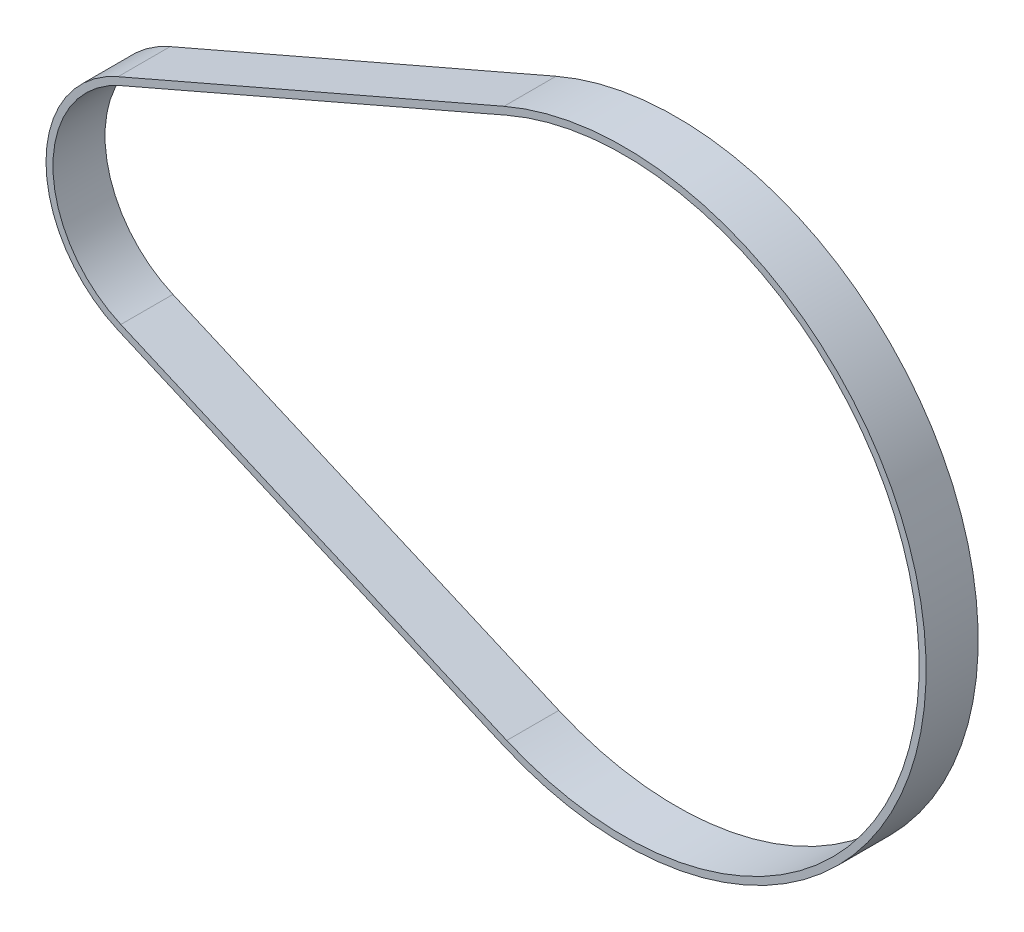
ISO-10303-21;
HEADER;
FILE_DESCRIPTION(('STEP AP214'),'2;1');
FILE_NAME('part.step','',(''),(''),'','','');
FILE_SCHEMA(('AUTOMOTIVE_DESIGN { 1 0 10303 214 1 1 1 1 }'));
ENDSEC;
DATA;
#1=APPLICATION_CONTEXT('core data for automotive mechanical design processes');
#2=APPLICATION_PROTOCOL_DEFINITION('international standard','automotive_design',2000,#1);
#3=PRODUCT_CONTEXT('',#1,'mechanical');
#4=PRODUCT('Part','Part','',(#3));
#5=PRODUCT_RELATED_PRODUCT_CATEGORY('part','',(#4));
#6=PRODUCT_DEFINITION_FORMATION('','',#4);
#7=PRODUCT_DEFINITION_CONTEXT('part definition',#1,'design');
#8=PRODUCT_DEFINITION('design','',#6,#7);
#9=PRODUCT_DEFINITION_SHAPE('','',#8);
#10=(LENGTH_UNIT() NAMED_UNIT(*) SI_UNIT(.MILLI.,.METRE.));
#11=(NAMED_UNIT(*) PLANE_ANGLE_UNIT() SI_UNIT($,.RADIAN.));
#12=(NAMED_UNIT(*) SI_UNIT($,.STERADIAN.) SOLID_ANGLE_UNIT());
#13=UNCERTAINTY_MEASURE_WITH_UNIT(LENGTH_MEASURE(1.E-05),#10,'distance_accuracy_value','');
#14=(GEOMETRIC_REPRESENTATION_CONTEXT(3) GLOBAL_UNCERTAINTY_ASSIGNED_CONTEXT((#13)) GLOBAL_UNIT_ASSIGNED_CONTEXT((#10,
#11,#12)) REPRESENTATION_CONTEXT('',''));
#15=CARTESIAN_POINT('',(0.,0.,0.));
#16=DIRECTION('',(0.,0.,1.));
#17=DIRECTION('',(1.,0.,0.));
#18=AXIS2_PLACEMENT_3D('',#15,#16,#17);
#19=CARTESIAN_POINT('',(5.16947595841089E-13,0.,3.));
#20=DIRECTION('',(0.,0.,1.));
#21=DIRECTION('',(1.,0.,0.));
#22=AXIS2_PLACEMENT_3D('',#19,#20,#21);
#23=PLANE('',#22);
#24=CARTESIAN_POINT('',(5.16947595841089E-13,0.,3.));
#25=DIRECTION('',(0.,0.,1.));
#26=DIRECTION('',(1.,0.,0.));
#27=AXIS2_PLACEMENT_3D('',#24,#25,#26);
#28=CIRCLE('',#27,13.7880150000005);
#29=CARTESIAN_POINT('',(-5.4839995872167,12.650498257683,3.));
#30=VERTEX_POINT('',#29);
#31=CARTESIAN_POINT('',(-5.4839995872167,-12.650498257683,3.));
#32=VERTEX_POINT('',#31);
#33=EDGE_CURVE('E112',#30,#32,#28,.T.);
#34=ORIENTED_EDGE('',*,*,#33,.T.);
#35=DIRECTION('',(0.917499600753454,-0.397736700113596,0.));
#36=VECTOR('',#35,1.);
#37=CARTESIAN_POINT('',(-5.4839995872167,-12.650498257683,3.));
#38=LINE('',#37,#36);
#39=CARTESIAN_POINT('',(38.98016784094,-31.925745038881,3.));
#40=VERTEX_POINT('',#39);
#41=EDGE_CURVE('E155',#32,#40,#38,.T.);
#42=ORIENTED_EDGE('',*,*,#41,.T.);
#43=CARTESIAN_POINT('',(52.8199999999997,0.,3.));
#44=DIRECTION('',(0.,0.,1.));
#45=DIRECTION('',(1.,0.,0.));
#46=AXIS2_PLACEMENT_3D('',#43,#44,#45);
#47=CIRCLE('',#46,34.7964675000003);
#48=CARTESIAN_POINT('',(38.98016784094,31.925745038881,3.));
#49=VERTEX_POINT('',#48);
#50=EDGE_CURVE('E157',#40,#49,#47,.T.);
#51=ORIENTED_EDGE('',*,*,#50,.T.);
#52=DIRECTION('',(-0.917499600753454,-0.397736700113596,0.));
#53=VECTOR('',#52,1.);
#54=CARTESIAN_POINT('',(38.98016784094,31.925745038881,3.));
#55=LINE('',#54,#53);
#56=EDGE_CURVE('E59',#49,#30,#55,.T.);
#57=ORIENTED_EDGE('',*,*,#56,.T.);
#58=EDGE_LOOP('',(#34,#42,#51,#57));
#59=FACE_BOUND('',#58,.T.);
#60=DIRECTION('',(0.917499600753455,-0.397736700113594,0.));
#61=VECTOR('',#60,1.);
#62=CARTESIAN_POINT('',(-5.1658102271259,-11.91649857708,3.));
#63=LINE('',#62,#61);
#64=CARTESIAN_POINT('',(-5.1658102271259,-11.91649857708,3.));
#65=VERTEX_POINT('',#64);
#66=CARTESIAN_POINT('',(39.298357201031,-31.191745358278,3.));
#67=VERTEX_POINT('',#66);
#68=EDGE_CURVE('E144',#65,#67,#63,.T.);
#69=ORIENTED_EDGE('',*,*,#68,.F.);
#70=CARTESIAN_POINT('',(5.16947595841089E-13,0.,3.));
#71=DIRECTION('',(0.,0.,1.));
#72=DIRECTION('',(1.,0.,0.));
#73=AXIS2_PLACEMENT_3D('',#70,#71,#72);
#74=CIRCLE('',#73,12.9880150000003);
#75=CARTESIAN_POINT('',(-5.1658102271259,11.91649857708,3.));
#76=VERTEX_POINT('',#75);
#77=EDGE_CURVE('E109',#76,#65,#74,.T.);
#78=ORIENTED_EDGE('',*,*,#77,.F.);
#79=DIRECTION('',(-0.917499600753455,-0.397736700113594,0.));
#80=VECTOR('',#79,1.);
#81=CARTESIAN_POINT('',(39.298357201031,31.191745358278,3.));
#82=LINE('',#81,#80);
#83=CARTESIAN_POINT('',(39.298357201031,31.191745358278,3.));
#84=VERTEX_POINT('',#83);
#85=EDGE_CURVE('E148',#84,#76,#82,.T.);
#86=ORIENTED_EDGE('',*,*,#85,.F.);
#87=CARTESIAN_POINT('',(52.8199999999997,0.,3.));
#88=DIRECTION('',(0.,0.,1.));
#89=DIRECTION('',(1.,0.,0.));
#90=AXIS2_PLACEMENT_3D('',#87,#88,#89);
#91=CIRCLE('',#90,33.9964675);
#92=EDGE_CURVE('E146',#67,#84,#91,.T.);
#93=ORIENTED_EDGE('',*,*,#92,.F.);
#94=EDGE_LOOP('',(#69,#78,#86,#93));
#95=FACE_BOUND('',#94,.T.);
#96=ADVANCED_FACE('F36',(#59,#95),#23,.T.);
#97=CARTESIAN_POINT('',(5.16947595841089E-13,0.,3.));
#98=DIRECTION('',(0.,0.,-1.));
#99=DIRECTION('',(-1.,0.,0.));
#100=AXIS2_PLACEMENT_3D('',#97,#98,#99);
#101=CYLINDRICAL_SURFACE('',#100,13.7880150000005);
#102=DIRECTION('',(0.,0.,-1.));
#103=VECTOR('',#102,1.);
#104=CARTESIAN_POINT('',(-5.4839995872167,12.650498257683,3.));
#105=LINE('',#104,#103);
#106=CARTESIAN_POINT('',(-5.4839995872167,12.650498257683,-3.));
#107=VERTEX_POINT('',#106);
#108=EDGE_CURVE('E160',#30,#107,#105,.T.);
#109=ORIENTED_EDGE('',*,*,#108,.T.);
#110=CARTESIAN_POINT('',(5.16947595841089E-13,0.,-3.));
#111=DIRECTION('',(0.,0.,1.));
#112=DIRECTION('',(1.,0.,0.));
#113=AXIS2_PLACEMENT_3D('',#110,#111,#112);
#114=CIRCLE('',#113,13.7880150000005);
#115=CARTESIAN_POINT('',(-5.4839995872167,-12.650498257683,-3.));
#116=VERTEX_POINT('',#115);
#117=EDGE_CURVE('E131',#107,#116,#114,.T.);
#118=ORIENTED_EDGE('',*,*,#117,.T.);
#119=DIRECTION('',(0.,0.,-1.));
#120=VECTOR('',#119,1.);
#121=CARTESIAN_POINT('',(-5.4839995872167,-12.650498257683,3.));
#122=LINE('',#121,#120);
#123=EDGE_CURVE('E11',#32,#116,#122,.T.);
#124=ORIENTED_EDGE('',*,*,#123,.F.);
#125=ORIENTED_EDGE('',*,*,#33,.F.);
#126=EDGE_LOOP('',(#109,#118,#124,#125));
#127=FACE_BOUND('',#126,.T.);
#128=ADVANCED_FACE('F38',(#127),#101,.T.);
#129=CARTESIAN_POINT('',(-5.4839995872167,-12.650498257683,3.));
#130=DIRECTION('',(0.397736700113596,0.917499600753454,0.));
#131=DIRECTION('',(-0.917499600753454,0.397736700113596,0.));
#132=AXIS2_PLACEMENT_3D('',#129,#130,#131);
#133=PLANE('',#132);
#134=ORIENTED_EDGE('',*,*,#123,.T.);
#135=DIRECTION('',(0.917499600753454,-0.397736700113596,0.));
#136=VECTOR('',#135,1.);
#137=CARTESIAN_POINT('',(-5.4839995872167,-12.650498257683,-3.));
#138=LINE('',#137,#136);
#139=CARTESIAN_POINT('',(38.98016784094,-31.925745038881,-3.));
#140=VERTEX_POINT('',#139);
#141=EDGE_CURVE('E134',#116,#140,#138,.T.);
#142=ORIENTED_EDGE('',*,*,#141,.T.);
#143=DIRECTION('',(0.,0.,-1.));
#144=VECTOR('',#143,1.);
#145=CARTESIAN_POINT('',(38.98016784094,-31.925745038881,3.));
#146=LINE('',#145,#144);
#147=EDGE_CURVE('E44',#40,#140,#146,.T.);
#148=ORIENTED_EDGE('',*,*,#147,.F.);
#149=ORIENTED_EDGE('',*,*,#41,.F.);
#150=EDGE_LOOP('',(#134,#142,#148,#149));
#151=FACE_BOUND('',#150,.T.);
#152=ADVANCED_FACE('F173',(#151),#133,.F.);
#153=CARTESIAN_POINT('',(52.8199999999997,0.,3.));
#154=DIRECTION('',(0.,0.,-1.));
#155=DIRECTION('',(-1.,0.,0.));
#156=AXIS2_PLACEMENT_3D('',#153,#154,#155);
#157=CYLINDRICAL_SURFACE('',#156,34.7964675000003);
#158=ORIENTED_EDGE('',*,*,#147,.T.);
#159=CARTESIAN_POINT('',(52.8199999999997,0.,-3.));
#160=DIRECTION('',(0.,0.,1.));
#161=DIRECTION('',(1.,0.,0.));
#162=AXIS2_PLACEMENT_3D('',#159,#160,#161);
#163=CIRCLE('',#162,34.7964675000003);
#164=CARTESIAN_POINT('',(38.98016784094,31.925745038881,-3.));
#165=VERTEX_POINT('',#164);
#166=EDGE_CURVE('E137',#140,#165,#163,.T.);
#167=ORIENTED_EDGE('',*,*,#166,.T.);
#168=DIRECTION('',(0.,0.,-1.));
#169=VECTOR('',#168,1.);
#170=CARTESIAN_POINT('',(38.98016784094,31.925745038881,3.));
#171=LINE('',#170,#169);
#172=EDGE_CURVE('E162',#49,#165,#171,.T.);
#173=ORIENTED_EDGE('',*,*,#172,.F.);
#174=ORIENTED_EDGE('',*,*,#50,.F.);
#175=EDGE_LOOP('',(#158,#167,#173,#174));
#176=FACE_BOUND('',#175,.T.);
#177=ADVANCED_FACE('F167',(#176),#157,.T.);
#178=CARTESIAN_POINT('',(38.98016784094,31.925745038881,3.));
#179=DIRECTION('',(0.397736700113596,-0.917499600753454,0.));
#180=DIRECTION('',(0.917499600753454,0.397736700113596,0.));
#181=AXIS2_PLACEMENT_3D('',#178,#179,#180);
#182=PLANE('',#181);
#183=ORIENTED_EDGE('',*,*,#172,.T.);
#184=DIRECTION('',(-0.917499600753454,-0.397736700113596,0.));
#185=VECTOR('',#184,1.);
#186=CARTESIAN_POINT('',(38.98016784094,31.925745038881,-3.));
#187=LINE('',#186,#185);
#188=EDGE_CURVE('E140',#165,#107,#187,.T.);
#189=ORIENTED_EDGE('',*,*,#188,.T.);
#190=ORIENTED_EDGE('',*,*,#108,.F.);
#191=ORIENTED_EDGE('',*,*,#56,.F.);
#192=EDGE_LOOP('',(#183,#189,#190,#191));
#193=FACE_BOUND('',#192,.T.);
#194=ADVANCED_FACE('F178',(#193),#182,.F.);
#195=CARTESIAN_POINT('',(5.16947595841089E-13,0.,3.));
#196=DIRECTION('',(0.,0.,-1.));
#197=DIRECTION('',(-1.,0.,0.));
#198=AXIS2_PLACEMENT_3D('',#195,#196,#197);
#199=CYLINDRICAL_SURFACE('',#198,12.9880150000003);
#200=DIRECTION('',(0.,0.,-1.));
#201=VECTOR('',#200,1.);
#202=CARTESIAN_POINT('',(-5.1658102271259,-11.91649857708,3.));
#203=LINE('',#202,#201);
#204=CARTESIAN_POINT('',(-5.1658102271259,-11.91649857708,-3.));
#205=VERTEX_POINT('',#204);
#206=EDGE_CURVE('E101',#65,#205,#203,.T.);
#207=ORIENTED_EDGE('',*,*,#206,.T.);
#208=CARTESIAN_POINT('',(5.16947595841089E-13,0.,-3.));
#209=DIRECTION('',(0.,0.,1.));
#210=DIRECTION('',(1.,0.,0.));
#211=AXIS2_PLACEMENT_3D('',#208,#209,#210);
#212=CIRCLE('',#211,12.9880150000003);
#213=CARTESIAN_POINT('',(-5.1658102271259,11.91649857708,-3.));
#214=VERTEX_POINT('',#213);
#215=EDGE_CURVE('E106',#214,#205,#212,.T.);
#216=ORIENTED_EDGE('',*,*,#215,.F.);
#217=DIRECTION('',(0.,0.,-1.));
#218=VECTOR('',#217,1.);
#219=CARTESIAN_POINT('',(-5.1658102271259,11.91649857708,3.));
#220=LINE('',#219,#218);
#221=EDGE_CURVE('E150',#76,#214,#220,.T.);
#222=ORIENTED_EDGE('',*,*,#221,.F.);
#223=ORIENTED_EDGE('',*,*,#77,.T.);
#224=EDGE_LOOP('',(#207,#216,#222,#223));
#225=FACE_BOUND('',#224,.T.);
#226=ADVANCED_FACE('F103',(#225),#199,.F.);
#227=CARTESIAN_POINT('',(-5.1658102271259,-11.91649857708,3.));
#228=DIRECTION('',(0.397736700113594,0.917499600753455,0.));
#229=DIRECTION('',(-0.917499600753455,0.397736700113594,0.));
#230=AXIS2_PLACEMENT_3D('',#227,#228,#229);
#231=PLANE('',#230);
#232=DIRECTION('',(0.,0.,-1.));
#233=VECTOR('',#232,1.);
#234=CARTESIAN_POINT('',(39.298357201031,-31.191745358278,3.));
#235=LINE('',#234,#233);
#236=CARTESIAN_POINT('',(39.298357201031,-31.191745358278,-3.));
#237=VERTEX_POINT('',#236);
#238=EDGE_CURVE('E113',#67,#237,#235,.T.);
#239=ORIENTED_EDGE('',*,*,#238,.T.);
#240=DIRECTION('',(0.917499600753455,-0.397736700113594,0.));
#241=VECTOR('',#240,1.);
#242=CARTESIAN_POINT('',(-5.1658102271259,-11.91649857708,-3.));
#243=LINE('',#242,#241);
#244=EDGE_CURVE('E116',#205,#237,#243,.T.);
#245=ORIENTED_EDGE('',*,*,#244,.F.);
#246=ORIENTED_EDGE('',*,*,#206,.F.);
#247=ORIENTED_EDGE('',*,*,#68,.T.);
#248=EDGE_LOOP('',(#239,#245,#246,#247));
#249=FACE_BOUND('',#248,.T.);
#250=ADVANCED_FACE('F117',(#249),#231,.T.);
#251=CARTESIAN_POINT('',(52.8199999999997,0.,3.));
#252=DIRECTION('',(0.,0.,-1.));
#253=DIRECTION('',(-1.,0.,0.));
#254=AXIS2_PLACEMENT_3D('',#251,#252,#253);
#255=CYLINDRICAL_SURFACE('',#254,33.9964675);
#256=DIRECTION('',(0.,0.,-1.));
#257=VECTOR('',#256,1.);
#258=CARTESIAN_POINT('',(39.298357201031,31.191745358278,3.));
#259=LINE('',#258,#257);
#260=CARTESIAN_POINT('',(39.298357201031,31.191745358278,-3.));
#261=VERTEX_POINT('',#260);
#262=EDGE_CURVE('E51',#84,#261,#259,.T.);
#263=ORIENTED_EDGE('',*,*,#262,.T.);
#264=CARTESIAN_POINT('',(52.8199999999997,0.,-3.));
#265=DIRECTION('',(0.,0.,1.));
#266=DIRECTION('',(1.,0.,0.));
#267=AXIS2_PLACEMENT_3D('',#264,#265,#266);
#268=CIRCLE('',#267,33.9964675);
#269=EDGE_CURVE('E122',#237,#261,#268,.T.);
#270=ORIENTED_EDGE('',*,*,#269,.F.);
#271=ORIENTED_EDGE('',*,*,#238,.F.);
#272=ORIENTED_EDGE('',*,*,#92,.T.);
#273=EDGE_LOOP('',(#263,#270,#271,#272));
#274=FACE_BOUND('',#273,.T.);
#275=ADVANCED_FACE('F196',(#274),#255,.F.);
#276=CARTESIAN_POINT('',(39.298357201031,31.191745358278,3.));
#277=DIRECTION('',(0.397736700113594,-0.917499600753455,0.));
#278=DIRECTION('',(0.917499600753455,0.397736700113594,0.));
#279=AXIS2_PLACEMENT_3D('',#276,#277,#278);
#280=PLANE('',#279);
#281=ORIENTED_EDGE('',*,*,#221,.T.);
#282=DIRECTION('',(-0.917499600753455,-0.397736700113594,0.));
#283=VECTOR('',#282,1.);
#284=CARTESIAN_POINT('',(39.298357201031,31.191745358278,-3.));
#285=LINE('',#284,#283);
#286=EDGE_CURVE('E126',#261,#214,#285,.T.);
#287=ORIENTED_EDGE('',*,*,#286,.F.);
#288=ORIENTED_EDGE('',*,*,#262,.F.);
#289=ORIENTED_EDGE('',*,*,#85,.T.);
#290=EDGE_LOOP('',(#281,#287,#288,#289));
#291=FACE_BOUND('',#290,.T.);
#292=ADVANCED_FACE('F199',(#291),#280,.T.);
#293=CARTESIAN_POINT('',(5.16947595841089E-13,0.,-3.));
#294=DIRECTION('',(0.,0.,1.));
#295=DIRECTION('',(1.,0.,0.));
#296=AXIS2_PLACEMENT_3D('',#293,#294,#295);
#297=PLANE('',#296);
#298=ORIENTED_EDGE('',*,*,#286,.T.);
#299=ORIENTED_EDGE('',*,*,#215,.T.);
#300=ORIENTED_EDGE('',*,*,#244,.T.);
#301=ORIENTED_EDGE('',*,*,#269,.T.);
#302=EDGE_LOOP('',(#298,#299,#300,#301));
#303=FACE_BOUND('',#302,.T.);
#304=ORIENTED_EDGE('',*,*,#117,.F.);
#305=ORIENTED_EDGE('',*,*,#188,.F.);
#306=ORIENTED_EDGE('',*,*,#166,.F.);
#307=ORIENTED_EDGE('',*,*,#141,.F.);
#308=EDGE_LOOP('',(#304,#305,#306,#307));
#309=FACE_BOUND('',#308,.T.);
#310=ADVANCED_FACE('F124',(#303,#309),#297,.F.);
#311=CLOSED_SHELL('',(#96,#128,#152,#177,#194,#226,#250,#275,#292,#310));
#312=MANIFOLD_SOLID_BREP('B2',#311);
#313=ADVANCED_BREP_SHAPE_REPRESENTATION('',(#18,#312),#14);
#314=SHAPE_DEFINITION_REPRESENTATION(#9,#313);
ENDSEC;
END-ISO-10303-21;
